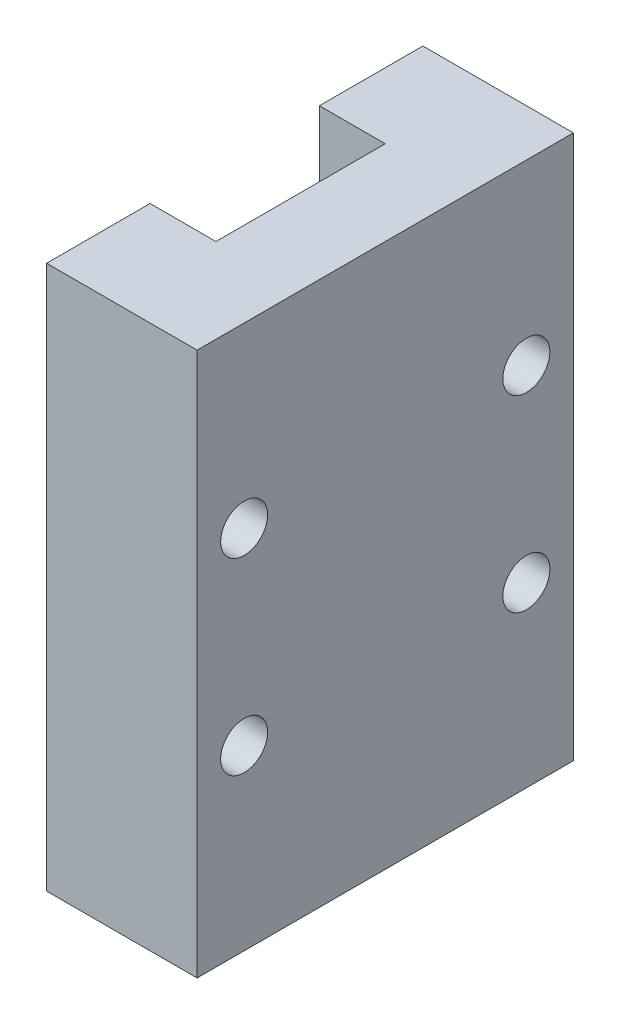
ISO-10303-21;
HEADER;
FILE_DESCRIPTION(('STEP AP214'),'2;1');
FILE_NAME('part.step','',(''),(''),'','','');
FILE_SCHEMA(('AUTOMOTIVE_DESIGN { 1 0 10303 214 1 1 1 1 }'));
ENDSEC;
DATA;
#1=APPLICATION_CONTEXT('core data for automotive mechanical design processes');
#2=APPLICATION_PROTOCOL_DEFINITION('international standard','automotive_design',2000,#1);
#3=PRODUCT_CONTEXT('',#1,'mechanical');
#4=PRODUCT('Part','Part','',(#3));
#5=PRODUCT_RELATED_PRODUCT_CATEGORY('part','',(#4));
#6=PRODUCT_DEFINITION_FORMATION('','',#4);
#7=PRODUCT_DEFINITION_CONTEXT('part definition',#1,'design');
#8=PRODUCT_DEFINITION('design','',#6,#7);
#9=PRODUCT_DEFINITION_SHAPE('','',#8);
#10=(LENGTH_UNIT() NAMED_UNIT(*) SI_UNIT(.MILLI.,.METRE.));
#11=(NAMED_UNIT(*) PLANE_ANGLE_UNIT() SI_UNIT($,.RADIAN.));
#12=(NAMED_UNIT(*) SI_UNIT($,.STERADIAN.) SOLID_ANGLE_UNIT());
#13=UNCERTAINTY_MEASURE_WITH_UNIT(LENGTH_MEASURE(1.E-05),#10,'distance_accuracy_value','');
#14=(GEOMETRIC_REPRESENTATION_CONTEXT(3) GLOBAL_UNCERTAINTY_ASSIGNED_CONTEXT((#13)) GLOBAL_UNIT_ASSIGNED_CONTEXT((#10,
#11,#12)) REPRESENTATION_CONTEXT('',''));
#15=CARTESIAN_POINT('',(0.,0.,0.));
#16=DIRECTION('',(0.,0.,1.));
#17=DIRECTION('',(1.,0.,0.));
#18=AXIS2_PLACEMENT_3D('',#15,#16,#17);
#19=CARTESIAN_POINT('',(0.,0.,0.));
#20=DIRECTION('',(-1.,0.,0.));
#21=DIRECTION('',(0.,0.,1.));
#22=AXIS2_PLACEMENT_3D('',#19,#20,#21);
#23=PLANE('',#22);
#24=DIRECTION('',(0.,1.,0.));
#25=VECTOR('',#24,1.);
#26=CARTESIAN_POINT('',(0.,-14.45,-4.5));
#27=LINE('',#26,#25);
#28=CARTESIAN_POINT('',(0.,-14.45,-4.5));
#29=VERTEX_POINT('',#28);
#30=CARTESIAN_POINT('',(0.,14.45,-4.5));
#31=VERTEX_POINT('',#30);
#32=EDGE_CURVE('E170',#29,#31,#27,.T.);
#33=ORIENTED_EDGE('',*,*,#32,.T.);
#34=DIRECTION('',(0.,0.,1.));
#35=VECTOR('',#34,1.);
#36=CARTESIAN_POINT('',(0.,14.45,10.));
#37=LINE('',#36,#35);
#38=CARTESIAN_POINT('',(0.,14.45,-10.));
#39=VERTEX_POINT('',#38);
#40=EDGE_CURVE('E190',#39,#31,#37,.T.);
#41=ORIENTED_EDGE('',*,*,#40,.F.);
#42=DIRECTION('',(0.,1.,0.));
#43=VECTOR('',#42,1.);
#44=CARTESIAN_POINT('',(0.,-14.45,-10.));
#45=LINE('',#44,#43);
#46=CARTESIAN_POINT('',(0.,-14.45,-10.));
#47=VERTEX_POINT('',#46);
#48=EDGE_CURVE('E173',#47,#39,#45,.T.);
#49=ORIENTED_EDGE('',*,*,#48,.F.);
#50=DIRECTION('',(0.,0.,-1.));
#51=VECTOR('',#50,1.);
#52=CARTESIAN_POINT('',(0.,-14.45,10.));
#53=LINE('',#52,#51);
#54=EDGE_CURVE('E83',#29,#47,#53,.T.);
#55=ORIENTED_EDGE('',*,*,#54,.F.);
#56=EDGE_LOOP('',(#33,#41,#49,#55));
#57=FACE_BOUND('',#56,.T.);
#58=ADVANCED_FACE('F38',(#57),#23,.T.);
#59=CARTESIAN_POINT('',(8.,-14.45,-10.));
#60=DIRECTION('',(0.,0.,1.));
#61=DIRECTION('',(1.,0.,0.));
#62=AXIS2_PLACEMENT_3D('',#59,#60,#61);
#63=PLANE('',#62);
#64=ORIENTED_EDGE('',*,*,#48,.T.);
#65=DIRECTION('',(-1.,0.,0.));
#66=VECTOR('',#65,1.);
#67=CARTESIAN_POINT('',(8.,14.45,-10.));
#68=LINE('',#67,#66);
#69=CARTESIAN_POINT('',(8.,14.45,-10.));
#70=VERTEX_POINT('',#69);
#71=EDGE_CURVE('E11',#70,#39,#68,.T.);
#72=ORIENTED_EDGE('',*,*,#71,.F.);
#73=DIRECTION('',(0.,1.,0.));
#74=VECTOR('',#73,1.);
#75=CARTESIAN_POINT('',(8.,-14.45,-10.));
#76=LINE('',#75,#74);
#77=CARTESIAN_POINT('',(8.,-14.45,-10.));
#78=VERTEX_POINT('',#77);
#79=EDGE_CURVE('E179',#78,#70,#76,.T.);
#80=ORIENTED_EDGE('',*,*,#79,.F.);
#81=DIRECTION('',(-1.,0.,0.));
#82=VECTOR('',#81,1.);
#83=CARTESIAN_POINT('',(8.,-14.45,-10.));
#84=LINE('',#83,#82);
#85=EDGE_CURVE('E186',#78,#47,#84,.T.);
#86=ORIENTED_EDGE('',*,*,#85,.T.);
#87=EDGE_LOOP('',(#64,#72,#80,#86));
#88=FACE_BOUND('',#87,.T.);
#89=ADVANCED_FACE('F40',(#88),#63,.F.);
#90=CARTESIAN_POINT('',(8.,14.45,10.));
#91=DIRECTION('',(0.,-1.,0.));
#92=DIRECTION('',(0.,0.,-1.));
#93=AXIS2_PLACEMENT_3D('',#90,#91,#92);
#94=PLANE('',#93);
#95=ORIENTED_EDGE('',*,*,#40,.T.);
#96=DIRECTION('',(-1.,0.,0.));
#97=VECTOR('',#96,1.);
#98=CARTESIAN_POINT('',(0.,14.45,-4.5));
#99=LINE('',#98,#97);
#100=CARTESIAN_POINT('',(3.5,14.45,-4.5));
#101=VERTEX_POINT('',#100);
#102=EDGE_CURVE('E158',#101,#31,#99,.T.);
#103=ORIENTED_EDGE('',*,*,#102,.F.);
#104=DIRECTION('',(0.,0.,-1.));
#105=VECTOR('',#104,1.);
#106=CARTESIAN_POINT('',(3.5,14.45,-4.5));
#107=LINE('',#106,#105);
#108=CARTESIAN_POINT('',(3.5,14.45,4.5));
#109=VERTEX_POINT('',#108);
#110=EDGE_CURVE('E166',#109,#101,#107,.T.);
#111=ORIENTED_EDGE('',*,*,#110,.F.);
#112=DIRECTION('',(1.,0.,0.));
#113=VECTOR('',#112,1.);
#114=CARTESIAN_POINT('',(0.,14.45,4.5));
#115=LINE('',#114,#113);
#116=CARTESIAN_POINT('',(0.,14.45,4.5));
#117=VERTEX_POINT('',#116);
#118=EDGE_CURVE('E155',#117,#109,#115,.T.);
#119=ORIENTED_EDGE('',*,*,#118,.F.);
#120=CARTESIAN_POINT('',(0.,14.45,10.));
#121=VERTEX_POINT('',#120);
#122=EDGE_CURVE('E189',#117,#121,#37,.T.);
#123=ORIENTED_EDGE('',*,*,#122,.T.);
#124=DIRECTION('',(-1.,0.,0.));
#125=VECTOR('',#124,1.);
#126=CARTESIAN_POINT('',(8.,14.45,10.));
#127=LINE('',#126,#125);
#128=CARTESIAN_POINT('',(8.,14.45,10.));
#129=VERTEX_POINT('',#128);
#130=EDGE_CURVE('E46',#129,#121,#127,.T.);
#131=ORIENTED_EDGE('',*,*,#130,.F.);
#132=DIRECTION('',(0.,0.,1.));
#133=VECTOR('',#132,1.);
#134=CARTESIAN_POINT('',(8.,14.45,10.));
#135=LINE('',#134,#133);
#136=EDGE_CURVE('E90',#70,#129,#135,.T.);
#137=ORIENTED_EDGE('',*,*,#136,.F.);
#138=ORIENTED_EDGE('',*,*,#71,.T.);
#139=EDGE_LOOP('',(#95,#103,#111,#119,#123,#131,#137,#138));
#140=FACE_BOUND('',#139,.T.);
#141=ADVANCED_FACE('F234',(#140),#94,.F.);
#142=CARTESIAN_POINT('',(8.,-14.45,10.));
#143=DIRECTION('',(0.,0.,-1.));
#144=DIRECTION('',(-1.,0.,0.));
#145=AXIS2_PLACEMENT_3D('',#142,#143,#144);
#146=PLANE('',#145);
#147=DIRECTION('',(0.,-1.,0.));
#148=VECTOR('',#147,1.);
#149=CARTESIAN_POINT('',(0.,-14.45,10.));
#150=LINE('',#149,#148);
#151=CARTESIAN_POINT('',(0.,-14.45,10.));
#152=VERTEX_POINT('',#151);
#153=EDGE_CURVE('E193',#121,#152,#150,.T.);
#154=ORIENTED_EDGE('',*,*,#153,.T.);
#155=DIRECTION('',(-1.,0.,0.));
#156=VECTOR('',#155,1.);
#157=CARTESIAN_POINT('',(8.,-14.45,10.));
#158=LINE('',#157,#156);
#159=CARTESIAN_POINT('',(8.,-14.45,10.));
#160=VERTEX_POINT('',#159);
#161=EDGE_CURVE('E198',#160,#152,#158,.T.);
#162=ORIENTED_EDGE('',*,*,#161,.F.);
#163=DIRECTION('',(0.,-1.,0.));
#164=VECTOR('',#163,1.);
#165=CARTESIAN_POINT('',(8.,-14.45,10.));
#166=LINE('',#165,#164);
#167=EDGE_CURVE('E183',#129,#160,#166,.T.);
#168=ORIENTED_EDGE('',*,*,#167,.F.);
#169=ORIENTED_EDGE('',*,*,#130,.T.);
#170=EDGE_LOOP('',(#154,#162,#168,#169));
#171=FACE_BOUND('',#170,.T.);
#172=ADVANCED_FACE('F204',(#171),#146,.F.);
#173=CARTESIAN_POINT('',(8.,-14.45,10.));
#174=DIRECTION('',(0.,1.,0.));
#175=DIRECTION('',(0.,0.,1.));
#176=AXIS2_PLACEMENT_3D('',#173,#174,#175);
#177=PLANE('',#176);
#178=DIRECTION('',(0.,0.,-1.));
#179=VECTOR('',#178,1.);
#180=CARTESIAN_POINT('',(3.5,-14.45,-4.5));
#181=LINE('',#180,#179);
#182=CARTESIAN_POINT('',(3.5,-14.45,4.5));
#183=VERTEX_POINT('',#182);
#184=CARTESIAN_POINT('',(3.5,-14.45,-4.5));
#185=VERTEX_POINT('',#184);
#186=EDGE_CURVE('E157',#183,#185,#181,.T.);
#187=ORIENTED_EDGE('',*,*,#186,.T.);
#188=DIRECTION('',(-1.,0.,0.));
#189=VECTOR('',#188,1.);
#190=CARTESIAN_POINT('',(0.,-14.45,-4.5));
#191=LINE('',#190,#189);
#192=EDGE_CURVE('E161',#185,#29,#191,.T.);
#193=ORIENTED_EDGE('',*,*,#192,.T.);
#194=ORIENTED_EDGE('',*,*,#54,.T.);
#195=ORIENTED_EDGE('',*,*,#85,.F.);
#196=DIRECTION('',(0.,0.,-1.));
#197=VECTOR('',#196,1.);
#198=CARTESIAN_POINT('',(8.,-14.45,10.));
#199=LINE('',#198,#197);
#200=EDGE_CURVE('E62',#160,#78,#199,.T.);
#201=ORIENTED_EDGE('',*,*,#200,.F.);
#202=ORIENTED_EDGE('',*,*,#161,.T.);
#203=CARTESIAN_POINT('',(0.,-14.45,4.5));
#204=VERTEX_POINT('',#203);
#205=EDGE_CURVE('E181',#152,#204,#53,.T.);
#206=ORIENTED_EDGE('',*,*,#205,.T.);
#207=DIRECTION('',(1.,0.,0.));
#208=VECTOR('',#207,1.);
#209=CARTESIAN_POINT('',(0.,-14.45,4.5));
#210=LINE('',#209,#208);
#211=EDGE_CURVE('E53',#204,#183,#210,.T.);
#212=ORIENTED_EDGE('',*,*,#211,.T.);
#213=EDGE_LOOP('',(#187,#193,#194,#195,#201,#202,#206,#212));
#214=FACE_BOUND('',#213,.T.);
#215=ADVANCED_FACE('F210',(#214),#177,.F.);
#216=CARTESIAN_POINT('',(8.,0.,0.));
#217=DIRECTION('',(-1.,0.,0.));
#218=DIRECTION('',(0.,0.,1.));
#219=AXIS2_PLACEMENT_3D('',#216,#217,#218);
#220=PLANE('',#219);
#221=CARTESIAN_POINT('',(8.,5.,7.5));
#222=DIRECTION('',(1.,0.,0.));
#223=DIRECTION('',(0.,0.,-1.));
#224=AXIS2_PLACEMENT_3D('',#221,#222,#223);
#225=CIRCLE('',#224,1.24999999999999);
#226=CARTESIAN_POINT('',(8.,5.,6.25000000000001));
#227=VERTEX_POINT('',#226);
#228=EDGE_CURVE('E133',#227,#227,#225,.T.);
#229=ORIENTED_EDGE('',*,*,#228,.F.);
#230=EDGE_LOOP('',(#229));
#231=FACE_BOUND('',#230,.T.);
#232=CARTESIAN_POINT('',(8.,-5.,-7.5));
#233=DIRECTION('',(1.,0.,0.));
#234=DIRECTION('',(0.,0.,-1.));
#235=AXIS2_PLACEMENT_3D('',#232,#233,#234);
#236=CIRCLE('',#235,1.24999999999999);
#237=CARTESIAN_POINT('',(8.,-5.,-8.74999999999999));
#238=VERTEX_POINT('',#237);
#239=EDGE_CURVE('E132',#238,#238,#236,.T.);
#240=ORIENTED_EDGE('',*,*,#239,.F.);
#241=EDGE_LOOP('',(#240));
#242=FACE_BOUND('',#241,.T.);
#243=CARTESIAN_POINT('',(8.,-5.,7.5));
#244=DIRECTION('',(1.,0.,0.));
#245=DIRECTION('',(0.,0.,-1.));
#246=AXIS2_PLACEMENT_3D('',#243,#244,#245);
#247=CIRCLE('',#246,1.24999999999999);
#248=CARTESIAN_POINT('',(8.,-5.,6.25000000000001));
#249=VERTEX_POINT('',#248);
#250=EDGE_CURVE('E143',#249,#249,#247,.T.);
#251=ORIENTED_EDGE('',*,*,#250,.F.);
#252=EDGE_LOOP('',(#251));
#253=FACE_BOUND('',#252,.T.);
#254=CARTESIAN_POINT('',(8.,5.,-7.5));
#255=DIRECTION('',(1.,0.,0.));
#256=DIRECTION('',(0.,0.,-1.));
#257=AXIS2_PLACEMENT_3D('',#254,#255,#256);
#258=CIRCLE('',#257,1.24999999999999);
#259=CARTESIAN_POINT('',(8.,5.,-8.74999999999999));
#260=VERTEX_POINT('',#259);
#261=EDGE_CURVE('E149',#260,#260,#258,.T.);
#262=ORIENTED_EDGE('',*,*,#261,.F.);
#263=EDGE_LOOP('',(#262));
#264=FACE_BOUND('',#263,.T.);
#265=ORIENTED_EDGE('',*,*,#79,.T.);
#266=ORIENTED_EDGE('',*,*,#136,.T.);
#267=ORIENTED_EDGE('',*,*,#167,.T.);
#268=ORIENTED_EDGE('',*,*,#200,.T.);
#269=EDGE_LOOP('',(#265,#266,#267,#268));
#270=FACE_BOUND('',#269,.T.);
#271=ADVANCED_FACE('F215',(#231,#242,#253,#264,#270),#220,.F.);
#272=DIRECTION('',(0.,1.,0.));
#273=VECTOR('',#272,1.);
#274=CARTESIAN_POINT('',(0.,-14.45,4.5));
#275=LINE('',#274,#273);
#276=EDGE_CURVE('E163',#204,#117,#275,.T.);
#277=ORIENTED_EDGE('',*,*,#276,.F.);
#278=ORIENTED_EDGE('',*,*,#205,.F.);
#279=ORIENTED_EDGE('',*,*,#153,.F.);
#280=ORIENTED_EDGE('',*,*,#122,.F.);
#281=EDGE_LOOP('',(#277,#278,#279,#280));
#282=FACE_BOUND('',#281,.T.);
#283=ADVANCED_FACE('F209',(#282),#23,.T.);
#284=CARTESIAN_POINT('',(0.,-14.45,-4.5));
#285=DIRECTION('',(0.,0.,-1.));
#286=DIRECTION('',(-1.,0.,0.));
#287=AXIS2_PLACEMENT_3D('',#284,#285,#286);
#288=PLANE('',#287);
#289=ORIENTED_EDGE('',*,*,#102,.T.);
#290=ORIENTED_EDGE('',*,*,#32,.F.);
#291=ORIENTED_EDGE('',*,*,#192,.F.);
#292=DIRECTION('',(0.,1.,0.));
#293=VECTOR('',#292,1.);
#294=CARTESIAN_POINT('',(3.5,-14.45,-4.5));
#295=LINE('',#294,#293);
#296=EDGE_CURVE('E174',#185,#101,#295,.T.);
#297=ORIENTED_EDGE('',*,*,#296,.T.);
#298=EDGE_LOOP('',(#289,#290,#291,#297));
#299=FACE_BOUND('',#298,.T.);
#300=ADVANCED_FACE('F223',(#299),#288,.F.);
#301=CARTESIAN_POINT('',(3.5,-14.45,-4.5));
#302=DIRECTION('',(1.,0.,0.));
#303=DIRECTION('',(0.,0.,-1.));
#304=AXIS2_PLACEMENT_3D('',#301,#302,#303);
#305=PLANE('',#304);
#306=ORIENTED_EDGE('',*,*,#110,.T.);
#307=ORIENTED_EDGE('',*,*,#296,.F.);
#308=ORIENTED_EDGE('',*,*,#186,.F.);
#309=DIRECTION('',(0.,1.,0.));
#310=VECTOR('',#309,1.);
#311=CARTESIAN_POINT('',(3.5,-14.45,4.5));
#312=LINE('',#311,#310);
#313=EDGE_CURVE('E176',#183,#109,#312,.T.);
#314=ORIENTED_EDGE('',*,*,#313,.T.);
#315=EDGE_LOOP('',(#306,#307,#308,#314));
#316=FACE_BOUND('',#315,.T.);
#317=ADVANCED_FACE('F246',(#316),#305,.F.);
#318=CARTESIAN_POINT('',(0.,-14.45,4.5));
#319=DIRECTION('',(0.,0.,1.));
#320=DIRECTION('',(1.,0.,0.));
#321=AXIS2_PLACEMENT_3D('',#318,#319,#320);
#322=PLANE('',#321);
#323=ORIENTED_EDGE('',*,*,#118,.T.);
#324=ORIENTED_EDGE('',*,*,#313,.F.);
#325=ORIENTED_EDGE('',*,*,#211,.F.);
#326=ORIENTED_EDGE('',*,*,#276,.T.);
#327=EDGE_LOOP('',(#323,#324,#325,#326));
#328=FACE_BOUND('',#327,.T.);
#329=ADVANCED_FACE('F248',(#328),#322,.F.);
#330=CARTESIAN_POINT('',(1.5,5.,-7.5));
#331=DIRECTION('',(1.,0.,0.));
#332=DIRECTION('',(0.,0.,-1.));
#333=AXIS2_PLACEMENT_3D('',#330,#331,#332);
#334=CONICAL_SURFACE('',#333,1.25,1.02974425867665);
#335=CARTESIAN_POINT('',(0.748924226215549,5.,-7.5));
#336=VERTEX_POINT('',#335);
#337=VERTEX_LOOP('',#336);
#338=FACE_BOUND('',#337,.T.);
#339=CARTESIAN_POINT('',(1.5,5.,-7.5));
#340=DIRECTION('',(1.,0.,0.));
#341=DIRECTION('',(0.,0.,-1.));
#342=AXIS2_PLACEMENT_3D('',#339,#340,#341);
#343=CIRCLE('',#342,1.25);
#344=CARTESIAN_POINT('',(1.5,5.,-8.75));
#345=VERTEX_POINT('',#344);
#346=EDGE_CURVE('E152',#345,#345,#343,.T.);
#347=ORIENTED_EDGE('',*,*,#346,.T.);
#348=EDGE_LOOP('',(#347));
#349=FACE_BOUND('',#348,.T.);
#350=ADVANCED_FACE('F250',(#338,#349),#334,.F.);
#351=CARTESIAN_POINT('',(8.,5.,-7.5));
#352=DIRECTION('',(1.,0.,0.));
#353=DIRECTION('',(0.,0.,-1.));
#354=AXIS2_PLACEMENT_3D('',#351,#352,#353);
#355=CYLINDRICAL_SURFACE('',#354,1.24999999999999);
#356=ORIENTED_EDGE('',*,*,#346,.F.);
#357=EDGE_LOOP('',(#356));
#358=FACE_BOUND('',#357,.T.);
#359=ORIENTED_EDGE('',*,*,#261,.T.);
#360=EDGE_LOOP('',(#359));
#361=FACE_BOUND('',#360,.T.);
#362=ADVANCED_FACE('F255',(#358,#361),#355,.F.);
#363=CARTESIAN_POINT('',(1.5,-5.,7.5));
#364=DIRECTION('',(1.,0.,0.));
#365=DIRECTION('',(0.,0.,-1.));
#366=AXIS2_PLACEMENT_3D('',#363,#364,#365);
#367=CONICAL_SURFACE('',#366,1.25,1.02974425867665);
#368=CARTESIAN_POINT('',(0.748924226215549,-5.,7.5));
#369=VERTEX_POINT('',#368);
#370=VERTEX_LOOP('',#369);
#371=FACE_BOUND('',#370,.T.);
#372=CARTESIAN_POINT('',(1.5,-5.,7.5));
#373=DIRECTION('',(1.,0.,0.));
#374=DIRECTION('',(0.,0.,-1.));
#375=AXIS2_PLACEMENT_3D('',#372,#373,#374);
#376=CIRCLE('',#375,1.25);
#377=CARTESIAN_POINT('',(1.5,-5.,6.25));
#378=VERTEX_POINT('',#377);
#379=EDGE_CURVE('E146',#378,#378,#376,.T.);
#380=ORIENTED_EDGE('',*,*,#379,.T.);
#381=EDGE_LOOP('',(#380));
#382=FACE_BOUND('',#381,.T.);
#383=ADVANCED_FACE('F264',(#371,#382),#367,.F.);
#384=CARTESIAN_POINT('',(8.,-5.,7.5));
#385=DIRECTION('',(1.,0.,0.));
#386=DIRECTION('',(0.,0.,-1.));
#387=AXIS2_PLACEMENT_3D('',#384,#385,#386);
#388=CYLINDRICAL_SURFACE('',#387,1.24999999999999);
#389=ORIENTED_EDGE('',*,*,#379,.F.);
#390=EDGE_LOOP('',(#389));
#391=FACE_BOUND('',#390,.T.);
#392=ORIENTED_EDGE('',*,*,#250,.T.);
#393=EDGE_LOOP('',(#392));
#394=FACE_BOUND('',#393,.T.);
#395=ADVANCED_FACE('F268',(#391,#394),#388,.F.);
#396=CARTESIAN_POINT('',(1.5,-5.,-7.5));
#397=DIRECTION('',(1.,0.,0.));
#398=DIRECTION('',(0.,0.,-1.));
#399=AXIS2_PLACEMENT_3D('',#396,#397,#398);
#400=CONICAL_SURFACE('',#399,1.25,1.02974425867665);
#401=CARTESIAN_POINT('',(0.748924226215549,-5.,-7.5));
#402=VERTEX_POINT('',#401);
#403=VERTEX_LOOP('',#402);
#404=FACE_BOUND('',#403,.T.);
#405=CARTESIAN_POINT('',(1.5,-5.,-7.5));
#406=DIRECTION('',(1.,0.,0.));
#407=DIRECTION('',(0.,0.,-1.));
#408=AXIS2_PLACEMENT_3D('',#405,#406,#407);
#409=CIRCLE('',#408,1.25);
#410=CARTESIAN_POINT('',(1.5,-5.,-8.75));
#411=VERTEX_POINT('',#410);
#412=EDGE_CURVE('E136',#411,#411,#409,.T.);
#413=ORIENTED_EDGE('',*,*,#412,.T.);
#414=EDGE_LOOP('',(#413));
#415=FACE_BOUND('',#414,.T.);
#416=ADVANCED_FACE('F272',(#404,#415),#400,.F.);
#417=CARTESIAN_POINT('',(8.,-5.,-7.5));
#418=DIRECTION('',(1.,0.,0.));
#419=DIRECTION('',(0.,0.,-1.));
#420=AXIS2_PLACEMENT_3D('',#417,#418,#419);
#421=CYLINDRICAL_SURFACE('',#420,1.24999999999999);
#422=ORIENTED_EDGE('',*,*,#412,.F.);
#423=EDGE_LOOP('',(#422));
#424=FACE_BOUND('',#423,.T.);
#425=ORIENTED_EDGE('',*,*,#239,.T.);
#426=EDGE_LOOP('',(#425));
#427=FACE_BOUND('',#426,.T.);
#428=ADVANCED_FACE('F126',(#424,#427),#421,.F.);
#429=CARTESIAN_POINT('',(1.5,5.,7.5));
#430=DIRECTION('',(1.,0.,0.));
#431=DIRECTION('',(0.,0.,-1.));
#432=AXIS2_PLACEMENT_3D('',#429,#430,#431);
#433=CONICAL_SURFACE('',#432,1.25,1.02974425867665);
#434=CARTESIAN_POINT('',(0.748924226215549,5.,7.5));
#435=VERTEX_POINT('',#434);
#436=VERTEX_LOOP('',#435);
#437=FACE_BOUND('',#436,.T.);
#438=CARTESIAN_POINT('',(1.5,5.,7.5));
#439=DIRECTION('',(1.,0.,0.));
#440=DIRECTION('',(0.,0.,-1.));
#441=AXIS2_PLACEMENT_3D('',#438,#439,#440);
#442=CIRCLE('',#441,1.25);
#443=CARTESIAN_POINT('',(1.5,5.,6.25));
#444=VERTEX_POINT('',#443);
#445=EDGE_CURVE('E130',#444,#444,#442,.T.);
#446=ORIENTED_EDGE('',*,*,#445,.T.);
#447=EDGE_LOOP('',(#446));
#448=FACE_BOUND('',#447,.T.);
#449=ADVANCED_FACE('F122',(#437,#448),#433,.F.);
#450=CARTESIAN_POINT('',(8.,5.,7.5));
#451=DIRECTION('',(1.,0.,0.));
#452=DIRECTION('',(0.,0.,-1.));
#453=AXIS2_PLACEMENT_3D('',#450,#451,#452);
#454=CYLINDRICAL_SURFACE('',#453,1.24999999999999);
#455=ORIENTED_EDGE('',*,*,#445,.F.);
#456=EDGE_LOOP('',(#455));
#457=FACE_BOUND('',#456,.T.);
#458=ORIENTED_EDGE('',*,*,#228,.T.);
#459=EDGE_LOOP('',(#458));
#460=FACE_BOUND('',#459,.T.);
#461=ADVANCED_FACE('F125',(#457,#460),#454,.F.);
#462=CLOSED_SHELL('',(#58,#89,#141,#172,#215,#271,#283,#300,#317,#329,#350,#362,#383,#395,#416,
#428,#449,#461));
#463=MANIFOLD_SOLID_BREP('B2',#462);
#464=ADVANCED_BREP_SHAPE_REPRESENTATION('',(#18,#463),#14);
#465=SHAPE_DEFINITION_REPRESENTATION(#9,#464);
ENDSEC;
END-ISO-10303-21;
